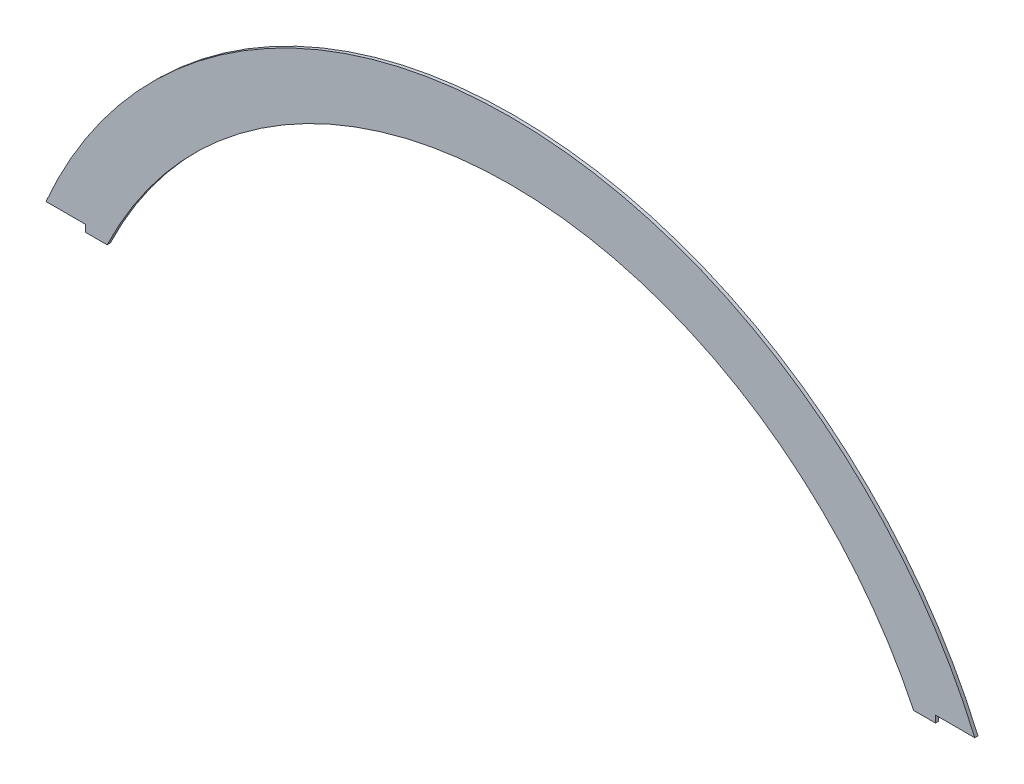
ISO-10303-21;
HEADER;
FILE_DESCRIPTION(('STEP AP214'),'2;1');
FILE_NAME('part.step','',(''),(''),'','','');
FILE_SCHEMA(('AUTOMOTIVE_DESIGN { 1 0 10303 214 1 1 1 1 }'));
ENDSEC;
DATA;
#1=APPLICATION_CONTEXT('core data for automotive mechanical design processes');
#2=APPLICATION_PROTOCOL_DEFINITION('international standard','automotive_design',2000,#1);
#3=PRODUCT_CONTEXT('',#1,'mechanical');
#4=PRODUCT('Part','Part','',(#3));
#5=PRODUCT_RELATED_PRODUCT_CATEGORY('part','',(#4));
#6=PRODUCT_DEFINITION_FORMATION('','',#4);
#7=PRODUCT_DEFINITION_CONTEXT('part definition',#1,'design');
#8=PRODUCT_DEFINITION('design','',#6,#7);
#9=PRODUCT_DEFINITION_SHAPE('','',#8);
#10=(LENGTH_UNIT() NAMED_UNIT(*) SI_UNIT(.MILLI.,.METRE.));
#11=(NAMED_UNIT(*) PLANE_ANGLE_UNIT() SI_UNIT($,.RADIAN.));
#12=(NAMED_UNIT(*) SI_UNIT($,.STERADIAN.) SOLID_ANGLE_UNIT());
#13=UNCERTAINTY_MEASURE_WITH_UNIT(LENGTH_MEASURE(1.E-05),#10,'distance_accuracy_value','');
#14=(GEOMETRIC_REPRESENTATION_CONTEXT(3) GLOBAL_UNCERTAINTY_ASSIGNED_CONTEXT((#13)) GLOBAL_UNIT_ASSIGNED_CONTEXT((#10,
#11,#12)) REPRESENTATION_CONTEXT('',''));
#15=CARTESIAN_POINT('',(0.,0.,0.));
#16=DIRECTION('',(0.,0.,1.));
#17=DIRECTION('',(1.,0.,0.));
#18=AXIS2_PLACEMENT_3D('',#15,#16,#17);
#19=CARTESIAN_POINT('',(0.,0.,-6.));
#20=DIRECTION('',(0.,0.,1.));
#21=DIRECTION('',(1.,0.,0.));
#22=AXIS2_PLACEMENT_3D('',#19,#20,#21);
#23=CYLINDRICAL_SURFACE('',#22,950.);
#24=CARTESIAN_POINT('',(0.,0.,0.));
#25=DIRECTION('',(0.,0.,1.));
#26=DIRECTION('',(1.,0.,0.));
#27=AXIS2_PLACEMENT_3D('',#24,#25,#26);
#28=CIRCLE('',#27,950.);
#29=CARTESIAN_POINT('',(872.424208742513,376.,0.));
#30=VERTEX_POINT('',#29);
#31=CARTESIAN_POINT('',(-872.424208742513,376.,0.));
#32=VERTEX_POINT('',#31);
#33=EDGE_CURVE('E158',#30,#32,#28,.T.);
#34=ORIENTED_EDGE('',*,*,#33,.F.);
#35=DIRECTION('',(0.,0.,1.));
#36=VECTOR('',#35,1.);
#37=CARTESIAN_POINT('',(872.424208742513,376.,-6.));
#38=LINE('',#37,#36);
#39=CARTESIAN_POINT('',(872.424208742513,376.,-6.));
#40=VERTEX_POINT('',#39);
#41=EDGE_CURVE('E112',#30,#40,#38,.F.);
#42=ORIENTED_EDGE('',*,*,#41,.T.);
#43=CARTESIAN_POINT('',(0.,0.,-6.));
#44=DIRECTION('',(0.,0.,1.));
#45=DIRECTION('',(1.,0.,0.));
#46=AXIS2_PLACEMENT_3D('',#43,#44,#45);
#47=CIRCLE('',#46,950.);
#48=CARTESIAN_POINT('',(-872.424208742513,376.,-6.));
#49=VERTEX_POINT('',#48);
#50=EDGE_CURVE('E161',#40,#49,#47,.T.);
#51=ORIENTED_EDGE('',*,*,#50,.T.);
#52=DIRECTION('',(0.,0.,1.));
#53=VECTOR('',#52,1.);
#54=CARTESIAN_POINT('',(-872.424208742513,376.,-6.));
#55=LINE('',#54,#53);
#56=EDGE_CURVE('E138',#32,#49,#55,.F.);
#57=ORIENTED_EDGE('',*,*,#56,.F.);
#58=EDGE_LOOP('',(#34,#42,#51,#57));
#59=FACE_BOUND('',#58,.T.);
#60=ADVANCED_FACE('F38',(#59),#23,.T.);
#61=CARTESIAN_POINT('',(0.,0.,-6.));
#62=DIRECTION('',(0.,0.,1.));
#63=DIRECTION('',(1.,0.,0.));
#64=AXIS2_PLACEMENT_3D('',#61,#62,#63);
#65=PLANE('',#64);
#66=DIRECTION('',(0.,1.,0.));
#67=VECTOR('',#66,1.);
#68=CARTESIAN_POINT('',(798.516336457505,0.,-6.));
#69=LINE('',#68,#67);
#70=CARTESIAN_POINT('',(798.516336457505,363.,-6.));
#71=VERTEX_POINT('',#70);
#72=CARTESIAN_POINT('',(798.516336457505,376.,-6.));
#73=VERTEX_POINT('',#72);
#74=EDGE_CURVE('E104',#71,#73,#69,.T.);
#75=ORIENTED_EDGE('',*,*,#74,.F.);
#76=DIRECTION('',(1.,0.,0.));
#77=VECTOR('',#76,1.);
#78=CARTESIAN_POINT('',(0.,363.,-6.));
#79=LINE('',#78,#77);
#80=CARTESIAN_POINT('',(757.516336457505,363.,-6.));
#81=VERTEX_POINT('',#80);
#82=EDGE_CURVE('E145',#71,#81,#79,.F.);
#83=ORIENTED_EDGE('',*,*,#82,.T.);
#84=CARTESIAN_POINT('',(0.,0.,-6.));
#85=DIRECTION('',(0.,0.,1.));
#86=DIRECTION('',(1.,0.,0.));
#87=AXIS2_PLACEMENT_3D('',#84,#85,#86);
#88=CIRCLE('',#87,840.);
#89=CARTESIAN_POINT('',(-757.516336457505,363.,-6.));
#90=VERTEX_POINT('',#89);
#91=EDGE_CURVE('E155',#81,#90,#88,.T.);
#92=ORIENTED_EDGE('',*,*,#91,.T.);
#93=DIRECTION('',(1.,0.,0.));
#94=VECTOR('',#93,1.);
#95=CARTESIAN_POINT('',(0.,363.,-6.));
#96=LINE('',#95,#94);
#97=CARTESIAN_POINT('',(-798.516336457505,363.,-6.));
#98=VERTEX_POINT('',#97);
#99=EDGE_CURVE('E141',#90,#98,#96,.F.);
#100=ORIENTED_EDGE('',*,*,#99,.T.);
#101=DIRECTION('',(0.,1.,0.));
#102=VECTOR('',#101,1.);
#103=CARTESIAN_POINT('',(-798.516336457505,0.,-6.));
#104=LINE('',#103,#102);
#105=CARTESIAN_POINT('',(-798.516336457505,376.,-6.));
#106=VERTEX_POINT('',#105);
#107=EDGE_CURVE('E59',#98,#106,#104,.T.);
#108=ORIENTED_EDGE('',*,*,#107,.T.);
#109=DIRECTION('',(-1.,0.,0.));
#110=VECTOR('',#109,1.);
#111=CARTESIAN_POINT('',(0.,376.,-6.));
#112=LINE('',#111,#110);
#113=EDGE_CURVE('E135',#106,#49,#112,.T.);
#114=ORIENTED_EDGE('',*,*,#113,.T.);
#115=ORIENTED_EDGE('',*,*,#50,.F.);
#116=DIRECTION('',(1.,0.,0.));
#117=VECTOR('',#116,1.);
#118=CARTESIAN_POINT('',(0.,376.,-6.));
#119=LINE('',#118,#117);
#120=EDGE_CURVE('E123',#73,#40,#119,.T.);
#121=ORIENTED_EDGE('',*,*,#120,.F.);
#122=EDGE_LOOP('',(#75,#83,#92,#100,#108,#114,#115,#121));
#123=FACE_BOUND('',#122,.T.);
#124=ADVANCED_FACE('F175',(#123),#65,.F.);
#125=CARTESIAN_POINT('',(0.,0.,0.));
#126=DIRECTION('',(0.,0.,1.));
#127=DIRECTION('',(1.,0.,0.));
#128=AXIS2_PLACEMENT_3D('',#125,#126,#127);
#129=PLANE('',#128);
#130=DIRECTION('',(-1.,0.,0.));
#131=VECTOR('',#130,1.);
#132=CARTESIAN_POINT('',(-1527.14795921947,363.,0.));
#133=LINE('',#132,#131);
#134=CARTESIAN_POINT('',(798.516336457505,363.,0.));
#135=VERTEX_POINT('',#134);
#136=CARTESIAN_POINT('',(757.516336457505,363.,0.));
#137=VERTEX_POINT('',#136);
#138=EDGE_CURVE('E119',#135,#137,#133,.T.);
#139=ORIENTED_EDGE('',*,*,#138,.F.);
#140=DIRECTION('',(0.,1.,0.));
#141=VECTOR('',#140,1.);
#142=CARTESIAN_POINT('',(798.516336457505,363.,0.));
#143=LINE('',#142,#141);
#144=CARTESIAN_POINT('',(798.516336457505,376.,0.));
#145=VERTEX_POINT('',#144);
#146=EDGE_CURVE('E52',#135,#145,#143,.T.);
#147=ORIENTED_EDGE('',*,*,#146,.T.);
#148=DIRECTION('',(1.,0.,0.));
#149=VECTOR('',#148,1.);
#150=CARTESIAN_POINT('',(877.912865835784,376.,0.));
#151=LINE('',#150,#149);
#152=EDGE_CURVE('E109',#145,#30,#151,.T.);
#153=ORIENTED_EDGE('',*,*,#152,.T.);
#154=ORIENTED_EDGE('',*,*,#33,.T.);
#155=DIRECTION('',(-1.,0.,0.));
#156=VECTOR('',#155,1.);
#157=CARTESIAN_POINT('',(-877.912865835784,376.,0.));
#158=LINE('',#157,#156);
#159=CARTESIAN_POINT('',(-798.516336457505,376.,0.));
#160=VERTEX_POINT('',#159);
#161=EDGE_CURVE('E129',#160,#32,#158,.T.);
#162=ORIENTED_EDGE('',*,*,#161,.F.);
#163=DIRECTION('',(0.,1.,0.));
#164=VECTOR('',#163,1.);
#165=CARTESIAN_POINT('',(-798.516336457505,363.,0.));
#166=LINE('',#165,#164);
#167=CARTESIAN_POINT('',(-798.516336457505,363.,0.));
#168=VERTEX_POINT('',#167);
#169=EDGE_CURVE('E126',#168,#160,#166,.T.);
#170=ORIENTED_EDGE('',*,*,#169,.F.);
#171=CARTESIAN_POINT('',(-757.516336457505,363.,0.));
#172=VERTEX_POINT('',#171);
#173=EDGE_CURVE('E147',#172,#168,#133,.T.);
#174=ORIENTED_EDGE('',*,*,#173,.F.);
#175=CARTESIAN_POINT('',(0.,0.,0.));
#176=DIRECTION('',(0.,0.,1.));
#177=DIRECTION('',(1.,0.,0.));
#178=AXIS2_PLACEMENT_3D('',#175,#176,#177);
#179=CIRCLE('',#178,840.);
#180=EDGE_CURVE('E154',#137,#172,#179,.T.);
#181=ORIENTED_EDGE('',*,*,#180,.F.);
#182=EDGE_LOOP('',(#139,#147,#153,#154,#162,#170,#174,#181));
#183=FACE_BOUND('',#182,.T.);
#184=ADVANCED_FACE('F117',(#183),#129,.T.);
#185=CARTESIAN_POINT('',(-1527.14795921947,363.,0.));
#186=DIRECTION('',(0.,1.,0.));
#187=DIRECTION('',(-1.,0.,0.));
#188=AXIS2_PLACEMENT_3D('',#185,#186,#187);
#189=PLANE('',#188);
#190=ORIENTED_EDGE('',*,*,#82,.F.);
#191=DIRECTION('',(0.,0.,-1.));
#192=VECTOR('',#191,1.);
#193=CARTESIAN_POINT('',(798.516336457505,363.,0.));
#194=LINE('',#193,#192);
#195=EDGE_CURVE('E11',#71,#135,#194,.F.);
#196=ORIENTED_EDGE('',*,*,#195,.T.);
#197=ORIENTED_EDGE('',*,*,#138,.T.);
#198=DIRECTION('',(0.,0.,1.));
#199=VECTOR('',#198,1.);
#200=CARTESIAN_POINT('',(757.516336457505,363.,0.));
#201=LINE('',#200,#199);
#202=EDGE_CURVE('E151',#137,#81,#201,.F.);
#203=ORIENTED_EDGE('',*,*,#202,.T.);
#204=EDGE_LOOP('',(#190,#196,#197,#203));
#205=FACE_BOUND('',#204,.T.);
#206=ADVANCED_FACE('F178',(#205),#189,.F.);
#207=CARTESIAN_POINT('',(0.,0.,-6.));
#208=DIRECTION('',(0.,0.,1.));
#209=DIRECTION('',(1.,0.,0.));
#210=AXIS2_PLACEMENT_3D('',#207,#208,#209);
#211=CYLINDRICAL_SURFACE('',#210,840.);
#212=DIRECTION('',(0.,0.,1.));
#213=VECTOR('',#212,1.);
#214=CARTESIAN_POINT('',(-757.516336457505,363.,0.));
#215=LINE('',#214,#213);
#216=EDGE_CURVE('E144',#172,#90,#215,.F.);
#217=ORIENTED_EDGE('',*,*,#216,.T.);
#218=ORIENTED_EDGE('',*,*,#91,.F.);
#219=ORIENTED_EDGE('',*,*,#202,.F.);
#220=ORIENTED_EDGE('',*,*,#180,.T.);
#221=EDGE_LOOP('',(#217,#218,#219,#220));
#222=FACE_BOUND('',#221,.T.);
#223=ADVANCED_FACE('F172',(#222),#211,.F.);
#224=DIRECTION('',(0.,0.,-1.));
#225=VECTOR('',#224,1.);
#226=CARTESIAN_POINT('',(-798.516336457505,363.,0.));
#227=LINE('',#226,#225);
#228=EDGE_CURVE('E45',#98,#168,#227,.F.);
#229=ORIENTED_EDGE('',*,*,#228,.F.);
#230=ORIENTED_EDGE('',*,*,#99,.F.);
#231=ORIENTED_EDGE('',*,*,#216,.F.);
#232=ORIENTED_EDGE('',*,*,#173,.T.);
#233=EDGE_LOOP('',(#229,#230,#231,#232));
#234=FACE_BOUND('',#233,.T.);
#235=ADVANCED_FACE('F169',(#234),#189,.F.);
#236=CARTESIAN_POINT('',(-798.516336457505,363.,-10.));
#237=DIRECTION('',(1.,0.,0.));
#238=DIRECTION('',(0.,0.,-1.));
#239=AXIS2_PLACEMENT_3D('',#236,#237,#238);
#240=PLANE('',#239);
#241=ORIENTED_EDGE('',*,*,#228,.T.);
#242=ORIENTED_EDGE('',*,*,#169,.T.);
#243=DIRECTION('',(0.,0.,1.));
#244=VECTOR('',#243,1.);
#245=CARTESIAN_POINT('',(-798.516336457505,376.,-10.));
#246=LINE('',#245,#244);
#247=EDGE_CURVE('E132',#106,#160,#246,.T.);
#248=ORIENTED_EDGE('',*,*,#247,.F.);
#249=ORIENTED_EDGE('',*,*,#107,.F.);
#250=EDGE_LOOP('',(#241,#242,#248,#249));
#251=FACE_BOUND('',#250,.T.);
#252=ADVANCED_FACE('F164',(#251),#240,.F.);
#253=CARTESIAN_POINT('',(-877.912865835784,376.,-10.));
#254=DIRECTION('',(0.,1.,0.));
#255=DIRECTION('',(0.,0.,1.));
#256=AXIS2_PLACEMENT_3D('',#253,#254,#255);
#257=PLANE('',#256);
#258=ORIENTED_EDGE('',*,*,#56,.T.);
#259=ORIENTED_EDGE('',*,*,#113,.F.);
#260=ORIENTED_EDGE('',*,*,#247,.T.);
#261=ORIENTED_EDGE('',*,*,#161,.T.);
#262=EDGE_LOOP('',(#258,#259,#260,#261));
#263=FACE_BOUND('',#262,.T.);
#264=ADVANCED_FACE('F197',(#263),#257,.F.);
#265=CARTESIAN_POINT('',(798.516336457505,363.,-10.));
#266=DIRECTION('',(1.,0.,0.));
#267=DIRECTION('',(0.,0.,-1.));
#268=AXIS2_PLACEMENT_3D('',#265,#266,#267);
#269=PLANE('',#268);
#270=ORIENTED_EDGE('',*,*,#74,.T.);
#271=DIRECTION('',(0.,0.,1.));
#272=VECTOR('',#271,1.);
#273=CARTESIAN_POINT('',(798.516336457505,376.,-10.));
#274=LINE('',#273,#272);
#275=EDGE_CURVE('E100',#73,#145,#274,.T.);
#276=ORIENTED_EDGE('',*,*,#275,.T.);
#277=ORIENTED_EDGE('',*,*,#146,.F.);
#278=ORIENTED_EDGE('',*,*,#195,.F.);
#279=EDGE_LOOP('',(#270,#276,#277,#278));
#280=FACE_BOUND('',#279,.T.);
#281=ADVANCED_FACE('F102',(#280),#269,.T.);
#282=CARTESIAN_POINT('',(877.912865835784,376.,-10.));
#283=DIRECTION('',(0.,-1.,0.));
#284=DIRECTION('',(0.,0.,-1.));
#285=AXIS2_PLACEMENT_3D('',#282,#283,#284);
#286=PLANE('',#285);
#287=ORIENTED_EDGE('',*,*,#152,.F.);
#288=ORIENTED_EDGE('',*,*,#275,.F.);
#289=ORIENTED_EDGE('',*,*,#120,.T.);
#290=ORIENTED_EDGE('',*,*,#41,.F.);
#291=EDGE_LOOP('',(#287,#288,#289,#290));
#292=FACE_BOUND('',#291,.T.);
#293=ADVANCED_FACE('F110',(#292),#286,.T.);
#294=CLOSED_SHELL('',(#60,#124,#184,#206,#223,#235,#252,#264,#281,#293));
#295=MANIFOLD_SOLID_BREP('B2',#294);
#296=ADVANCED_BREP_SHAPE_REPRESENTATION('',(#18,#295),#14);
#297=SHAPE_DEFINITION_REPRESENTATION(#9,#296);
ENDSEC;
END-ISO-10303-21;
